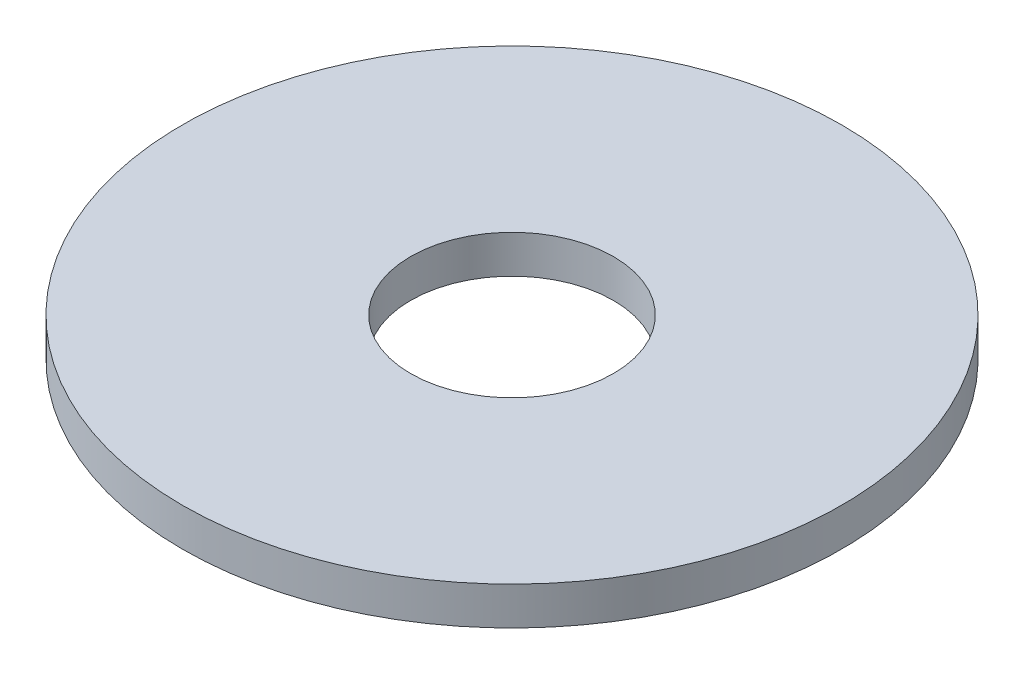
ISO-10303-21;
HEADER;
FILE_DESCRIPTION(('STEP AP214'),'2;1');
FILE_NAME('part.step','',(''),(''),'','','');
FILE_SCHEMA(('AUTOMOTIVE_DESIGN { 1 0 10303 214 1 1 1 1 }'));
ENDSEC;
DATA;
#1=APPLICATION_CONTEXT('core data for automotive mechanical design processes');
#2=APPLICATION_PROTOCOL_DEFINITION('international standard','automotive_design',2000,#1);
#3=PRODUCT_CONTEXT('',#1,'mechanical');
#4=PRODUCT('Part','Part','',(#3));
#5=PRODUCT_RELATED_PRODUCT_CATEGORY('part','',(#4));
#6=PRODUCT_DEFINITION_FORMATION('','',#4);
#7=PRODUCT_DEFINITION_CONTEXT('part definition',#1,'design');
#8=PRODUCT_DEFINITION('design','',#6,#7);
#9=PRODUCT_DEFINITION_SHAPE('','',#8);
#10=(LENGTH_UNIT() NAMED_UNIT(*) SI_UNIT(.MILLI.,.METRE.));
#11=(NAMED_UNIT(*) PLANE_ANGLE_UNIT() SI_UNIT($,.RADIAN.));
#12=(NAMED_UNIT(*) SI_UNIT($,.STERADIAN.) SOLID_ANGLE_UNIT());
#13=UNCERTAINTY_MEASURE_WITH_UNIT(LENGTH_MEASURE(1.E-05),#10,'distance_accuracy_value','');
#14=(GEOMETRIC_REPRESENTATION_CONTEXT(3) GLOBAL_UNCERTAINTY_ASSIGNED_CONTEXT((#13)) GLOBAL_UNIT_ASSIGNED_CONTEXT((#10,
#11,#12)) REPRESENTATION_CONTEXT('',''));
#15=CARTESIAN_POINT('',(0.,0.,0.));
#16=DIRECTION('',(0.,0.,1.));
#17=DIRECTION('',(1.,0.,0.));
#18=AXIS2_PLACEMENT_3D('',#15,#16,#17);
#19=CARTESIAN_POINT('',(0.,1.5,0.));
#20=DIRECTION('',(0.,1.,0.));
#21=DIRECTION('',(0.,0.,1.));
#22=AXIS2_PLACEMENT_3D('',#19,#20,#21);
#23=PLANE('',#22);
#24=CARTESIAN_POINT('',(0.,1.5,0.));
#25=DIRECTION('',(0.,1.,0.));
#26=DIRECTION('',(0.,0.,1.));
#27=AXIS2_PLACEMENT_3D('',#24,#25,#26);
#28=CIRCLE('',#27,13.);
#29=CARTESIAN_POINT('',(0.,1.5,13.));
#30=VERTEX_POINT('',#29);
#31=EDGE_CURVE('E10',#30,#30,#28,.T.);
#32=ORIENTED_EDGE('',*,*,#31,.T.);
#33=EDGE_LOOP('',(#32));
#34=FACE_BOUND('',#33,.T.);
#35=CARTESIAN_POINT('',(0.,1.5,0.));
#36=DIRECTION('',(0.,1.,0.));
#37=DIRECTION('',(0.,0.,1.));
#38=AXIS2_PLACEMENT_3D('',#35,#36,#37);
#39=CIRCLE('',#38,4.);
#40=CARTESIAN_POINT('',(0.,1.5,4.));
#41=VERTEX_POINT('',#40);
#42=EDGE_CURVE('E42',#41,#41,#39,.T.);
#43=ORIENTED_EDGE('',*,*,#42,.F.);
#44=EDGE_LOOP('',(#43));
#45=FACE_BOUND('',#44,.T.);
#46=ADVANCED_FACE('F31',(#34,#45),#23,.T.);
#47=CARTESIAN_POINT('',(0.,0.,0.));
#48=DIRECTION('',(0.,1.,0.));
#49=DIRECTION('',(0.,0.,1.));
#50=AXIS2_PLACEMENT_3D('',#47,#48,#49);
#51=PLANE('',#50);
#52=CARTESIAN_POINT('',(0.,0.,0.));
#53=DIRECTION('',(0.,1.,0.));
#54=DIRECTION('',(0.,0.,1.));
#55=AXIS2_PLACEMENT_3D('',#52,#53,#54);
#56=CIRCLE('',#55,13.);
#57=CARTESIAN_POINT('',(0.,0.,13.));
#58=VERTEX_POINT('',#57);
#59=EDGE_CURVE('E35',#58,#58,#56,.T.);
#60=ORIENTED_EDGE('',*,*,#59,.F.);
#61=EDGE_LOOP('',(#60));
#62=FACE_BOUND('',#61,.T.);
#63=CARTESIAN_POINT('',(0.,0.,0.));
#64=DIRECTION('',(0.,1.,0.));
#65=DIRECTION('',(0.,0.,1.));
#66=AXIS2_PLACEMENT_3D('',#63,#64,#65);
#67=CIRCLE('',#66,4.);
#68=CARTESIAN_POINT('',(0.,0.,4.));
#69=VERTEX_POINT('',#68);
#70=EDGE_CURVE('E44',#69,#69,#67,.T.);
#71=ORIENTED_EDGE('',*,*,#70,.T.);
#72=EDGE_LOOP('',(#71));
#73=FACE_BOUND('',#72,.T.);
#74=ADVANCED_FACE('F54',(#62,#73),#51,.F.);
#75=CARTESIAN_POINT('',(0.,1.5,0.));
#76=DIRECTION('',(0.,-1.,0.));
#77=DIRECTION('',(0.,0.,-1.));
#78=AXIS2_PLACEMENT_3D('',#75,#76,#77);
#79=CYLINDRICAL_SURFACE('',#78,13.);
#80=ORIENTED_EDGE('',*,*,#31,.F.);
#81=EDGE_LOOP('',(#80));
#82=FACE_BOUND('',#81,.T.);
#83=ORIENTED_EDGE('',*,*,#59,.T.);
#84=EDGE_LOOP('',(#83));
#85=FACE_BOUND('',#84,.T.);
#86=ADVANCED_FACE('F33',(#82,#85),#79,.T.);
#87=CARTESIAN_POINT('',(0.,1.5,0.));
#88=DIRECTION('',(0.,-1.,0.));
#89=DIRECTION('',(0.,0.,-1.));
#90=AXIS2_PLACEMENT_3D('',#87,#88,#89);
#91=CYLINDRICAL_SURFACE('',#90,4.);
#92=ORIENTED_EDGE('',*,*,#42,.T.);
#93=EDGE_LOOP('',(#92));
#94=FACE_BOUND('',#93,.T.);
#95=ORIENTED_EDGE('',*,*,#70,.F.);
#96=EDGE_LOOP('',(#95));
#97=FACE_BOUND('',#96,.T.);
#98=ADVANCED_FACE('F50',(#94,#97),#91,.F.);
#99=CLOSED_SHELL('',(#46,#74,#86,#98));
#100=MANIFOLD_SOLID_BREP('B2',#99);
#101=ADVANCED_BREP_SHAPE_REPRESENTATION('',(#18,#100),#14);
#102=SHAPE_DEFINITION_REPRESENTATION(#9,#101);
ENDSEC;
END-ISO-10303-21;
